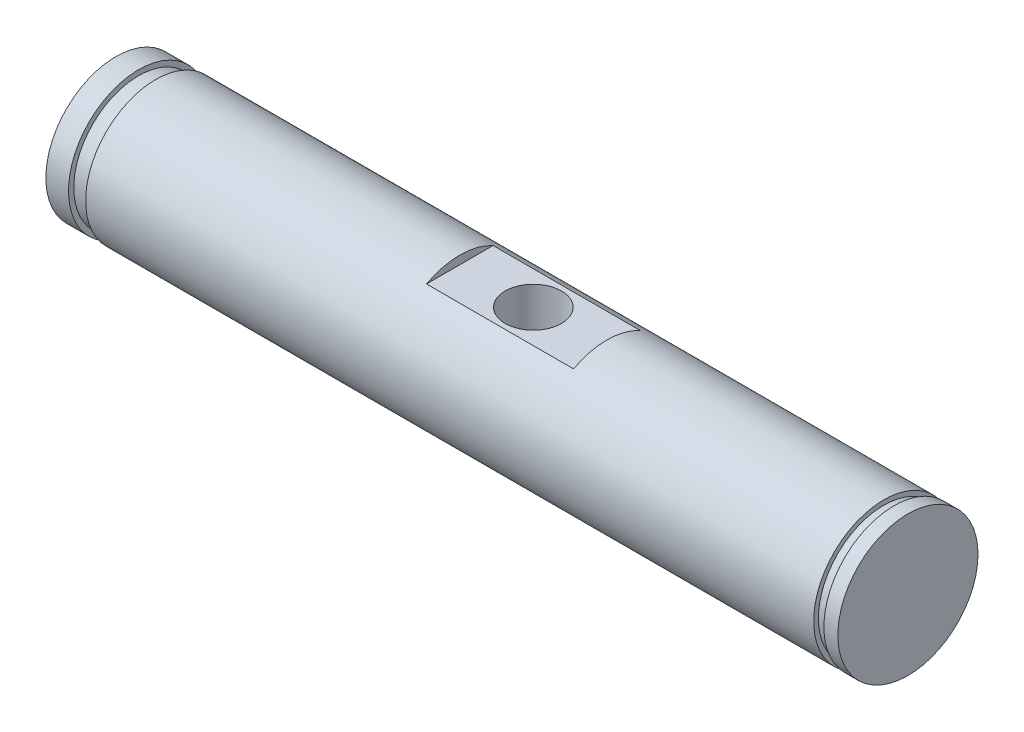
ISO-10303-21;
HEADER;
FILE_DESCRIPTION(('STEP AP214'),'2;1');
FILE_NAME('part.step','',(''),(''),'','','');
FILE_SCHEMA(('AUTOMOTIVE_DESIGN { 1 0 10303 214 1 1 1 1 }'));
ENDSEC;
DATA;
#1=APPLICATION_CONTEXT('core data for automotive mechanical design processes');
#2=APPLICATION_PROTOCOL_DEFINITION('international standard','automotive_design',2000,#1);
#3=PRODUCT_CONTEXT('',#1,'mechanical');
#4=PRODUCT('Part','Part','',(#3));
#5=PRODUCT_RELATED_PRODUCT_CATEGORY('part','',(#4));
#6=PRODUCT_DEFINITION_FORMATION('','',#4);
#7=PRODUCT_DEFINITION_CONTEXT('part definition',#1,'design');
#8=PRODUCT_DEFINITION('design','',#6,#7);
#9=PRODUCT_DEFINITION_SHAPE('','',#8);
#10=(LENGTH_UNIT() NAMED_UNIT(*) SI_UNIT(.MILLI.,.METRE.));
#11=(NAMED_UNIT(*) PLANE_ANGLE_UNIT() SI_UNIT($,.RADIAN.));
#12=(NAMED_UNIT(*) SI_UNIT($,.STERADIAN.) SOLID_ANGLE_UNIT());
#13=UNCERTAINTY_MEASURE_WITH_UNIT(LENGTH_MEASURE(1.E-05),#10,'distance_accuracy_value','');
#14=(GEOMETRIC_REPRESENTATION_CONTEXT(3) GLOBAL_UNCERTAINTY_ASSIGNED_CONTEXT((#13)) GLOBAL_UNIT_ASSIGNED_CONTEXT((#10,
#11,#12)) REPRESENTATION_CONTEXT('',''));
#15=CARTESIAN_POINT('',(0.,0.,0.));
#16=DIRECTION('',(0.,0.,1.));
#17=DIRECTION('',(1.,0.,0.));
#18=AXIS2_PLACEMENT_3D('',#15,#16,#17);
#19=CARTESIAN_POINT('',(28.575,0.,0.));
#20=DIRECTION('',(-1.,0.,0.));
#21=DIRECTION('',(0.,0.,1.));
#22=AXIS2_PLACEMENT_3D('',#19,#20,#21);
#23=CYLINDRICAL_SURFACE('',#22,6.35);
#24=CARTESIAN_POINT('',(-7.91650595025434,-6.35,0.));
#25=CARTESIAN_POINT('',(-7.91649661125868,-6.34999304806874,0.137152590563424));
#26=CARTESIAN_POINT('',(-7.90538885228416,-6.34550570854028,0.274526179298315));
#27=CARTESIAN_POINT('',(-7.86135198370742,-6.32799859624412,0.545406210867716));
#28=CARTESIAN_POINT('',(-7.82836382585026,-6.31495573589492,0.678901166129097));
#29=CARTESIAN_POINT('',(-7.74195850679128,-6.2817396684711,0.93765847929374));
#30=CARTESIAN_POINT('',(-7.68860850893989,-6.26158991981214,1.06294633311217));
#31=CARTESIAN_POINT('',(-7.56326283114876,-6.21614281942444,1.30267951928128));
#32=CARTESIAN_POINT('',(-7.49127352546347,-6.19084722809909,1.41712854004813));
#33=CARTESIAN_POINT('',(-7.32708050754856,-6.13631999828522,1.63753539441426));
#34=CARTESIAN_POINT('',(-7.23413666010443,-6.1069653774522,1.74291121266193));
#35=CARTESIAN_POINT('',(-7.03223542301115,-6.0481863895213,1.93707323593065));
#36=CARTESIAN_POINT('',(-6.92327017718463,-6.01876199521394,2.02585125334072));
#37=CARTESIAN_POINT('',(-6.68645880564269,-5.96169986279921,2.18823813167984));
#38=CARTESIAN_POINT('',(-6.55798322262683,-5.93420233969043,2.26098339858474));
#39=CARTESIAN_POINT('',(-6.2893494936267,-5.88603907626437,2.38357178435739));
#40=CARTESIAN_POINT('',(-6.14919699025931,-5.86537005992217,2.43342588991175));
#41=CARTESIAN_POINT('',(-5.86787692372082,-5.83452558981196,2.5064570611452));
#42=CARTESIAN_POINT('',(-5.72704840295676,-5.82391378021108,2.53074906305579));
#43=CARTESIAN_POINT('',(-5.44294494971308,-5.81312158743501,2.55544871456329));
#44=CARTESIAN_POINT('',(-5.29967127259943,-5.81293600347312,2.55586827216115));
#45=CARTESIAN_POINT('',(-5.02550427861924,-5.82264534091095,2.53365545339497));
#46=CARTESIAN_POINT('',(-4.89444961026597,-5.83183133573759,2.51264426262923));
#47=CARTESIAN_POINT('',(-4.63791290401032,-5.85805796981581,2.45087143364756));
#48=CARTESIAN_POINT('',(-4.51243185359513,-5.87509999489578,2.41010631071102));
#49=CARTESIAN_POINT('',(-4.26755980822922,-5.91549406542853,2.30920424806732));
#50=CARTESIAN_POINT('',(-4.148346604483,-5.93896841007289,2.2486869842788));
#51=CARTESIAN_POINT('',(-3.92132617450274,-5.98954915060851,2.1102657336248));
#52=CARTESIAN_POINT('',(-3.8135232816271,-6.01665691759063,2.03235517588615));
#53=CARTESIAN_POINT('',(-3.60351814523573,-6.07402992197142,1.85420353945379));
#54=CARTESIAN_POINT('',(-3.50241192487265,-6.10437636024199,1.75269319282268));
#55=CARTESIAN_POINT('',(-3.31830509208017,-6.16300797653218,1.53383712498801));
#56=CARTESIAN_POINT('',(-3.23530815785996,-6.1912927350249,1.41648819460132));
#57=CARTESIAN_POINT('',(-3.08831790052643,-6.24333551925189,1.16615109270643));
#58=CARTESIAN_POINT('',(-3.02474086993233,-6.26699093045802,1.03289559737699));
#59=CARTESIAN_POINT('',(-2.92128429672104,-6.30633251872665,0.756388475795015));
#60=CARTESIAN_POINT('',(-2.88139259105392,-6.32202278550323,0.613142022475447));
#61=CARTESIAN_POINT('',(-2.82866480302056,-6.34291864136937,0.329902950281629));
#62=CARTESIAN_POINT('',(-2.81435604135467,-6.34869410367057,0.190226394779019));
#63=CARTESIAN_POINT('',(-2.80884686483738,-6.35090754458063,-0.08963819831884));
#64=CARTESIAN_POINT('',(-2.81764038586044,-6.3473479735458,-0.229826092046451));
#65=CARTESIAN_POINT('',(-2.85700661813447,-6.33166393929384,-0.500032677309312));
#66=CARTESIAN_POINT('',(-2.88657064254759,-6.31993636241371,-0.630223897491494));
#67=CARTESIAN_POINT('',(-2.96526247285571,-6.28950889121095,-0.883675174685728));
#68=CARTESIAN_POINT('',(-3.01439278762199,-6.27080810277367,-1.00693434052696));
#69=CARTESIAN_POINT('',(-3.13242652546313,-6.2275337552144,-1.24727618501287));
#70=CARTESIAN_POINT('',(-3.20188998811615,-6.20279772189873,-1.36405364068129));
#71=CARTESIAN_POINT('',(-3.35799761845509,-6.15012973013763,-1.5847059937915));
#72=CARTESIAN_POINT('',(-3.44464870927254,-6.12219648578789,-1.68857566450019));
#73=CARTESIAN_POINT('',(-3.63944520446649,-6.06386438406276,-1.88773053063361));
#74=CARTESIAN_POINT('',(-3.74863848887339,-6.03342530552616,-1.98198169049623));
#75=CARTESIAN_POINT('',(-3.98182380354855,-5.9752297659637,-2.15108053830993));
#76=CARTESIAN_POINT('',(-4.10581836978598,-5.9474737661202,-2.22592489421888));
#77=CARTESIAN_POINT('',(-4.36703519469749,-5.89772885227324,-2.35459646292973));
#78=CARTESIAN_POINT('',(-4.50437943834316,-5.87580162831969,-2.40820159223357));
#79=CARTESIAN_POINT('',(-4.78729401321011,-5.84114379091714,-2.49110345882805));
#80=CARTESIAN_POINT('',(-4.93285810276753,-5.8284062979499,-2.52041838243925));
#81=CARTESIAN_POINT('',(-5.21669683270023,-5.81457137458615,-2.55216217304462));
#82=CARTESIAN_POINT('',(-5.35473382662342,-5.81269627568292,-2.55638784616148));
#83=CARTESIAN_POINT('',(-5.6294539723959,-5.81875771897436,-2.54256086608564));
#84=CARTESIAN_POINT('',(-5.76613729774919,-5.82669298689808,-2.52451110625491));
#85=CARTESIAN_POINT('',(-6.02861649674481,-5.85079208061455,-2.46811809715365));
#86=CARTESIAN_POINT('',(-6.15462914290215,-5.86661102925355,-2.43062291862308));
#87=CARTESIAN_POINT('',(-6.39862298370464,-5.90444895134406,-2.33720121100695));
#88=CARTESIAN_POINT('',(-6.51660194453586,-5.92646964055536,-2.28126958060274));
#89=CARTESIAN_POINT('',(-6.74858678064551,-5.97580512840317,-2.14883980056635));
#90=CARTESIAN_POINT('',(-6.86197208029524,-6.00335185546816,-2.0713423459515));
#91=CARTESIAN_POINT('',(-7.07469236099028,-6.05993579915211,-1.89943729526246));
#92=CARTESIAN_POINT('',(-7.17402301312547,-6.08897347125354,-1.80502450937543));
#93=CARTESIAN_POINT('',(-7.36252029067895,-6.14756260987943,-1.59456803133813));
#94=CARTESIAN_POINT('',(-7.45058889818264,-6.17702228110564,-1.47751013231651));
#95=CARTESIAN_POINT('',(-7.60585897499107,-6.23118918201763,-1.22920158030935));
#96=CARTESIAN_POINT('',(-7.67305077059149,-6.25589420652726,-1.09794438564992));
#97=CARTESIAN_POINT('',(-7.78310550776827,-6.29735329315789,-0.82714956024148));
#98=CARTESIAN_POINT('',(-7.8263935496976,-6.31424535261242,-0.687808846675038));
#99=CARTESIAN_POINT('',(-7.8730606414345,-6.33264571166289,-0.474582491070512));
#100=CARTESIAN_POINT('',(-7.885569123115,-6.33762151518832,-0.402870618992058));
#101=CARTESIAN_POINT('',(-7.90441990140685,-6.34514446855661,-0.258527172772298));
#102=CARTESIAN_POINT('',(-7.91076654481241,-6.34769333043157,-0.185896283634981));
#103=CARTESIAN_POINT('',(-7.91567093938603,-6.34966466033005,-0.0754545673581419));
#104=CARTESIAN_POINT('',(-7.91650851975051,-6.35000191272825,-0.0377356484545668));
#105=CARTESIAN_POINT('',(-7.91650595025434,-6.35,0.));
#106=B_SPLINE_CURVE_WITH_KNOTS('',3,(#24,#25,#26,#27,#28,#29,#30,#31,#32,#33,#34,#35,#36,#37,
#38,#39,#40,#41,#42,#43,#44,#45,#46,#47,#48,#49,#50,#51,#52,#53,#54,#55,#56,#57,#58,#59,#60,#61,
#62,#63,#64,#65,#66,#67,#68,#69,#70,#71,#72,#73,#74,#75,#76,#77,#78,#79,#80,#81,#82,#83,#84,#85,
#86,#87,#88,#89,#90,#91,#92,#93,#94,#95,#96,#97,#98,#99,#100,#101,#102,#103,#104,#105),
.UNSPECIFIED.,.T.,.F.,(4,2,2,2,2,2,2,2,2,2,2,2,2,2,2,2,2,2,2,2,2,2,2,2,2,2,2,2,2,2,2,2,2,2,2,2,
2,2,2,2,4),(0.,0.411331059515128,0.823776712244995,1.2348735124512,1.645829911389,
2.07457553263975,2.50353209708505,2.95181404932943,3.39988062173098,3.82747226722299,
4.2548506205057,4.65213393839024,5.04948736513311,5.45499402143407,5.86065413086401,
6.29801539594674,6.73546541172751,7.18172360768628,7.62775243943511,8.04716062825998,
8.46645873749578,8.86668753121305,9.26696766046534,9.67951990853169,10.092238670252,
10.5324737496029,10.9727843649352,11.417584621804,11.8620515505696,12.2742621542482,
12.6864192214155,13.0819487597494,13.4775878320837,13.8960224723142,14.3145857135079,
14.760675264033,15.2069712122026,15.6450512739016,15.863699884533,16.0821941398345,
16.1953662220864),.UNSPECIFIED.);
#107=CARTESIAN_POINT('',(-7.91650595025434,-6.35,0.));
#108=VERTEX_POINT('',#107);
#109=EDGE_CURVE('E76',#108,#108,#106,.T.);
#110=ORIENTED_EDGE('',*,*,#109,.T.);
#111=EDGE_LOOP('',(#110));
#112=FACE_BOUND('',#111,.T.);
#113=DIRECTION('',(-1.,0.,0.));
#114=VECTOR('',#113,1.);
#115=CARTESIAN_POINT('',(28.575,5.588,3.01608289010764));
#116=LINE('',#115,#114);
#117=CARTESIAN_POINT('',(1.2984955615325,5.588,3.01608289010764));
#118=VERTEX_POINT('',#117);
#119=CARTESIAN_POINT('',(-12.0261074620412,5.588,3.01608289010764));
#120=VERTEX_POINT('',#119);
#121=EDGE_CURVE('E69',#118,#120,#116,.T.);
#122=ORIENTED_EDGE('',*,*,#121,.T.);
#123=CARTESIAN_POINT('',(-12.0261074620412,0.,0.));
#124=DIRECTION('',(-1.,0.,0.));
#125=DIRECTION('',(0.,0.,1.));
#126=AXIS2_PLACEMENT_3D('',#123,#124,#125);
#127=CIRCLE('',#126,6.35);
#128=CARTESIAN_POINT('',(-12.0261074620412,5.588,-3.01608289010764));
#129=VERTEX_POINT('',#128);
#130=EDGE_CURVE('E46',#120,#129,#127,.T.);
#131=ORIENTED_EDGE('',*,*,#130,.T.);
#132=DIRECTION('',(-1.,0.,0.));
#133=VECTOR('',#132,1.);
#134=CARTESIAN_POINT('',(28.575,5.588,-3.01608289010764));
#135=LINE('',#134,#133);
#136=CARTESIAN_POINT('',(1.2984955615325,5.588,-3.01608289010764));
#137=VERTEX_POINT('',#136);
#138=EDGE_CURVE('E64',#129,#137,#135,.F.);
#139=ORIENTED_EDGE('',*,*,#138,.T.);
#140=CARTESIAN_POINT('',(1.2984955615325,0.,0.));
#141=DIRECTION('',(1.,0.,0.));
#142=DIRECTION('',(0.,0.,-1.));
#143=AXIS2_PLACEMENT_3D('',#140,#141,#142);
#144=CIRCLE('',#143,6.35);
#145=EDGE_CURVE('E11',#137,#118,#144,.T.);
#146=ORIENTED_EDGE('',*,*,#145,.T.);
#147=EDGE_LOOP('',(#122,#131,#139,#146));
#148=FACE_BOUND('',#147,.T.);
#149=CARTESIAN_POINT('',(-39.5777445733843,0.,0.));
#150=DIRECTION('',(1.,0.,0.));
#151=DIRECTION('',(0.,0.,-1.));
#152=AXIS2_PLACEMENT_3D('',#149,#150,#151);
#153=CIRCLE('',#152,6.35);
#154=CARTESIAN_POINT('',(-39.5777445733843,0.,-6.35));
#155=VERTEX_POINT('',#154);
#156=EDGE_CURVE('E175',#155,#155,#153,.T.);
#157=ORIENTED_EDGE('',*,*,#156,.T.);
#158=EDGE_LOOP('',(#157));
#159=FACE_BOUND('',#158,.T.);
#160=CARTESIAN_POINT('',(26.3861940497457,0.,0.));
#161=DIRECTION('',(1.,0.,0.));
#162=DIRECTION('',(0.,0.,-1.));
#163=AXIS2_PLACEMENT_3D('',#160,#161,#162);
#164=CIRCLE('',#163,6.35);
#165=CARTESIAN_POINT('',(26.3861940497457,0.,-6.35));
#166=VERTEX_POINT('',#165);
#167=EDGE_CURVE('E159',#166,#166,#164,.T.);
#168=ORIENTED_EDGE('',*,*,#167,.F.);
#169=EDGE_LOOP('',(#168));
#170=FACE_BOUND('',#169,.T.);
#171=ADVANCED_FACE('F37',(#112,#148,#159,#170),#23,.T.);
#172=CARTESIAN_POINT('',(26.3861940497457,6.35,0.));
#173=DIRECTION('',(-1.,0.,0.));
#174=DIRECTION('',(0.,0.,1.));
#175=AXIS2_PLACEMENT_3D('',#172,#173,#174);
#176=PLANE('',#175);
#177=CARTESIAN_POINT('',(26.3861940497457,0.,0.));
#178=DIRECTION('',(1.,0.,0.));
#179=DIRECTION('',(0.,0.,-1.));
#180=AXIS2_PLACEMENT_3D('',#177,#178,#179);
#181=CIRCLE('',#180,5.92461822023627);
#182=CARTESIAN_POINT('',(26.3861940497457,0.,-5.92461822023627));
#183=VERTEX_POINT('',#182);
#184=EDGE_CURVE('E157',#183,#183,#181,.T.);
#185=ORIENTED_EDGE('',*,*,#184,.F.);
#186=EDGE_LOOP('',(#185));
#187=FACE_BOUND('',#186,.T.);
#188=ORIENTED_EDGE('',*,*,#167,.T.);
#189=EDGE_LOOP('',(#188));
#190=FACE_BOUND('',#189,.T.);
#191=ADVANCED_FACE('F120',(#187,#190),#176,.F.);
#192=CARTESIAN_POINT('',(28.575,0.,0.));
#193=DIRECTION('',(1.,0.,0.));
#194=DIRECTION('',(0.,0.,-1.));
#195=AXIS2_PLACEMENT_3D('',#192,#193,#194);
#196=CYLINDRICAL_SURFACE('',#195,5.92461822023627);
#197=CARTESIAN_POINT('',(27.3108670658629,0.,0.));
#198=DIRECTION('',(1.,0.,0.));
#199=DIRECTION('',(0.,0.,-1.));
#200=AXIS2_PLACEMENT_3D('',#197,#198,#199);
#201=CIRCLE('',#200,5.92461822023627);
#202=CARTESIAN_POINT('',(27.3108670658629,0.,-5.92461822023627));
#203=VERTEX_POINT('',#202);
#204=EDGE_CURVE('E149',#203,#203,#201,.T.);
#205=ORIENTED_EDGE('',*,*,#204,.F.);
#206=EDGE_LOOP('',(#205));
#207=FACE_BOUND('',#206,.T.);
#208=ORIENTED_EDGE('',*,*,#184,.T.);
#209=EDGE_LOOP('',(#208));
#210=FACE_BOUND('',#209,.T.);
#211=ADVANCED_FACE('F116',(#207,#210),#196,.T.);
#212=CARTESIAN_POINT('',(27.3108670658629,5.92461822023627,0.));
#213=DIRECTION('',(1.,0.,0.));
#214=DIRECTION('',(0.,0.,-1.));
#215=AXIS2_PLACEMENT_3D('',#212,#213,#214);
#216=PLANE('',#215);
#217=CARTESIAN_POINT('',(27.3108670658629,0.,0.));
#218=DIRECTION('',(1.,0.,0.));
#219=DIRECTION('',(0.,0.,-1.));
#220=AXIS2_PLACEMENT_3D('',#217,#218,#219);
#221=CIRCLE('',#220,6.35);
#222=CARTESIAN_POINT('',(27.3108670658629,0.,-6.35));
#223=VERTEX_POINT('',#222);
#224=EDGE_CURVE('E146',#223,#223,#221,.T.);
#225=ORIENTED_EDGE('',*,*,#224,.F.);
#226=EDGE_LOOP('',(#225));
#227=FACE_BOUND('',#226,.T.);
#228=ORIENTED_EDGE('',*,*,#204,.T.);
#229=EDGE_LOOP('',(#228));
#230=FACE_BOUND('',#229,.T.);
#231=ADVANCED_FACE('F112',(#227,#230),#216,.F.);
#232=CARTESIAN_POINT('',(28.575,0.,0.));
#233=DIRECTION('',(1.,0.,0.));
#234=DIRECTION('',(0.,0.,-1.));
#235=AXIS2_PLACEMENT_3D('',#232,#233,#234);
#236=PLANE('',#235);
#237=CARTESIAN_POINT('',(28.575,0.,0.));
#238=DIRECTION('',(1.,0.,0.));
#239=DIRECTION('',(0.,0.,-1.));
#240=AXIS2_PLACEMENT_3D('',#237,#238,#239);
#241=CIRCLE('',#240,6.35);
#242=CARTESIAN_POINT('',(28.575,0.,-6.35));
#243=VERTEX_POINT('',#242);
#244=EDGE_CURVE('E78',#243,#243,#241,.T.);
#245=ORIENTED_EDGE('',*,*,#244,.T.);
#246=EDGE_LOOP('',(#245));
#247=FACE_BOUND('',#246,.T.);
#248=ADVANCED_FACE('F115',(#247),#236,.T.);
#249=ORIENTED_EDGE('',*,*,#224,.T.);
#250=EDGE_LOOP('',(#249));
#251=FACE_BOUND('',#250,.T.);
#252=ORIENTED_EDGE('',*,*,#244,.F.);
#253=EDGE_LOOP('',(#252));
#254=FACE_BOUND('',#253,.T.);
#255=ADVANCED_FACE('F39',(#251,#254),#23,.T.);
#256=CARTESIAN_POINT('',(-41.1266692007538,6.35,0.));
#257=DIRECTION('',(-1.,0.,0.));
#258=DIRECTION('',(0.,0.,1.));
#259=AXIS2_PLACEMENT_3D('',#256,#257,#258);
#260=PLANE('',#259);
#261=CARTESIAN_POINT('',(-41.1266692007538,0.,0.));
#262=DIRECTION('',(1.,0.,0.));
#263=DIRECTION('',(0.,0.,-1.));
#264=AXIS2_PLACEMENT_3D('',#261,#262,#263);
#265=CIRCLE('',#264,5.87700442147382);
#266=CARTESIAN_POINT('',(-41.1266692007538,0.,-5.87700442147382));
#267=VERTEX_POINT('',#266);
#268=EDGE_CURVE('E151',#267,#267,#265,.T.);
#269=ORIENTED_EDGE('',*,*,#268,.F.);
#270=EDGE_LOOP('',(#269));
#271=FACE_BOUND('',#270,.T.);
#272=CARTESIAN_POINT('',(-41.1266692007538,0.,0.));
#273=DIRECTION('',(1.,0.,0.));
#274=DIRECTION('',(0.,0.,-1.));
#275=AXIS2_PLACEMENT_3D('',#272,#273,#274);
#276=CIRCLE('',#275,6.35);
#277=CARTESIAN_POINT('',(-41.1266692007538,0.,-6.35));
#278=VERTEX_POINT('',#277);
#279=EDGE_CURVE('E142',#278,#278,#276,.T.);
#280=ORIENTED_EDGE('',*,*,#279,.T.);
#281=EDGE_LOOP('',(#280));
#282=FACE_BOUND('',#281,.T.);
#283=ADVANCED_FACE('F104',(#271,#282),#260,.F.);
#284=CARTESIAN_POINT('',(28.575,0.,0.));
#285=DIRECTION('',(1.,0.,0.));
#286=DIRECTION('',(0.,0.,-1.));
#287=AXIS2_PLACEMENT_3D('',#284,#285,#286);
#288=CYLINDRICAL_SURFACE('',#287,5.87700442147382);
#289=CARTESIAN_POINT('',(-39.5777445733843,0.,0.));
#290=DIRECTION('',(1.,0.,0.));
#291=DIRECTION('',(0.,0.,-1.));
#292=AXIS2_PLACEMENT_3D('',#289,#290,#291);
#293=CIRCLE('',#292,5.87700442147382);
#294=CARTESIAN_POINT('',(-39.5777445733843,0.,-5.87700442147382));
#295=VERTEX_POINT('',#294);
#296=EDGE_CURVE('E172',#295,#295,#293,.T.);
#297=ORIENTED_EDGE('',*,*,#296,.F.);
#298=EDGE_LOOP('',(#297));
#299=FACE_BOUND('',#298,.T.);
#300=ORIENTED_EDGE('',*,*,#268,.T.);
#301=EDGE_LOOP('',(#300));
#302=FACE_BOUND('',#301,.T.);
#303=ADVANCED_FACE('F100',(#299,#302),#288,.T.);
#304=CARTESIAN_POINT('',(-39.5777445733843,5.87700442147382,0.));
#305=DIRECTION('',(1.,0.,0.));
#306=DIRECTION('',(0.,0.,-1.));
#307=AXIS2_PLACEMENT_3D('',#304,#305,#306);
#308=PLANE('',#307);
#309=ORIENTED_EDGE('',*,*,#156,.F.);
#310=EDGE_LOOP('',(#309));
#311=FACE_BOUND('',#310,.T.);
#312=ORIENTED_EDGE('',*,*,#296,.T.);
#313=EDGE_LOOP('',(#312));
#314=FACE_BOUND('',#313,.T.);
#315=ADVANCED_FACE('F96',(#311,#314),#308,.F.);
#316=CARTESIAN_POINT('',(-43.18,0.,0.));
#317=DIRECTION('',(1.,0.,0.));
#318=DIRECTION('',(0.,0.,-1.));
#319=AXIS2_PLACEMENT_3D('',#316,#317,#318);
#320=PLANE('',#319);
#321=CARTESIAN_POINT('',(-43.18,0.,0.));
#322=DIRECTION('',(1.,0.,0.));
#323=DIRECTION('',(0.,0.,-1.));
#324=AXIS2_PLACEMENT_3D('',#321,#322,#323);
#325=CIRCLE('',#324,6.35);
#326=CARTESIAN_POINT('',(-43.18,0.,-6.35));
#327=VERTEX_POINT('',#326);
#328=EDGE_CURVE('E145',#327,#327,#325,.T.);
#329=ORIENTED_EDGE('',*,*,#328,.F.);
#330=EDGE_LOOP('',(#329));
#331=FACE_BOUND('',#330,.T.);
#332=ADVANCED_FACE('F99',(#331),#320,.F.);
#333=ORIENTED_EDGE('',*,*,#279,.F.);
#334=EDGE_LOOP('',(#333));
#335=FACE_BOUND('',#334,.T.);
#336=ORIENTED_EDGE('',*,*,#328,.T.);
#337=EDGE_LOOP('',(#336));
#338=FACE_BOUND('',#337,.T.);
#339=ADVANCED_FACE('F93',(#335,#338),#23,.T.);
#340=CARTESIAN_POINT('',(-5.36380595025435,6.35,0.));
#341=DIRECTION('',(0.,1.,0.));
#342=DIRECTION('',(0.,0.,1.));
#343=AXIS2_PLACEMENT_3D('',#340,#341,#342);
#344=CYLINDRICAL_SURFACE('',#343,2.55269999999999);
#345=CARTESIAN_POINT('',(-5.36380595025435,5.588,0.));
#346=DIRECTION('',(0.,-1.,0.));
#347=DIRECTION('',(0.,0.,-1.));
#348=AXIS2_PLACEMENT_3D('',#345,#346,#347);
#349=CIRCLE('',#348,2.55269999999999);
#350=CARTESIAN_POINT('',(-5.36380595025435,5.588,-2.55269999999999));
#351=VERTEX_POINT('',#350);
#352=EDGE_CURVE('E70',#351,#351,#349,.F.);
#353=ORIENTED_EDGE('',*,*,#352,.T.);
#354=EDGE_LOOP('',(#353));
#355=FACE_BOUND('',#354,.T.);
#356=ORIENTED_EDGE('',*,*,#109,.F.);
#357=EDGE_LOOP('',(#356));
#358=FACE_BOUND('',#357,.T.);
#359=ADVANCED_FACE('F88',(#355,#358),#344,.F.);
#360=CARTESIAN_POINT('',(-12.0261074620412,5.588,-4.49503855608293));
#361=DIRECTION('',(-1.,0.,0.));
#362=DIRECTION('',(0.,0.,1.));
#363=AXIS2_PLACEMENT_3D('',#360,#361,#362);
#364=PLANE('',#363);
#365=DIRECTION('',(0.,0.,1.));
#366=VECTOR('',#365,1.);
#367=CARTESIAN_POINT('',(-12.0261074620412,5.588,-4.49503855608293));
#368=LINE('',#367,#366);
#369=EDGE_CURVE('E67',#129,#120,#368,.T.);
#370=ORIENTED_EDGE('',*,*,#369,.F.);
#371=ORIENTED_EDGE('',*,*,#130,.F.);
#372=EDGE_LOOP('',(#370,#371));
#373=FACE_BOUND('',#372,.T.);
#374=ADVANCED_FACE('F73',(#373),#364,.F.);
#375=CARTESIAN_POINT('',(1.2984955615325,5.588,-4.49503855608293));
#376=DIRECTION('',(1.,0.,0.));
#377=DIRECTION('',(0.,0.,-1.));
#378=AXIS2_PLACEMENT_3D('',#375,#376,#377);
#379=PLANE('',#378);
#380=DIRECTION('',(0.,0.,-1.));
#381=VECTOR('',#380,1.);
#382=CARTESIAN_POINT('',(1.2984955615325,5.588,-4.49503855608293));
#383=LINE('',#382,#381);
#384=EDGE_CURVE('E53',#118,#137,#383,.T.);
#385=ORIENTED_EDGE('',*,*,#384,.F.);
#386=ORIENTED_EDGE('',*,*,#145,.F.);
#387=EDGE_LOOP('',(#385,#386));
#388=FACE_BOUND('',#387,.T.);
#389=ADVANCED_FACE('F200',(#388),#379,.F.);
#390=CARTESIAN_POINT('',(0.,5.588,0.));
#391=DIRECTION('',(0.,-1.,0.));
#392=DIRECTION('',(0.,0.,-1.));
#393=AXIS2_PLACEMENT_3D('',#390,#391,#392);
#394=PLANE('',#393);
#395=ORIENTED_EDGE('',*,*,#352,.F.);
#396=EDGE_LOOP('',(#395));
#397=FACE_BOUND('',#396,.T.);
#398=ORIENTED_EDGE('',*,*,#384,.T.);
#399=ORIENTED_EDGE('',*,*,#138,.F.);
#400=ORIENTED_EDGE('',*,*,#369,.T.);
#401=ORIENTED_EDGE('',*,*,#121,.F.);
#402=EDGE_LOOP('',(#398,#399,#400,#401));
#403=FACE_BOUND('',#402,.T.);
#404=ADVANCED_FACE('F66',(#397,#403),#394,.F.);
#405=CLOSED_SHELL('',(#171,#191,#211,#231,#248,#255,#283,#303,#315,#332,#339,#359,#374,#389,#404));
#406=MANIFOLD_SOLID_BREP('B2',#405);
#407=ADVANCED_BREP_SHAPE_REPRESENTATION('',(#18,#406),#14);
#408=SHAPE_DEFINITION_REPRESENTATION(#9,#407);
ENDSEC;
END-ISO-10303-21;
